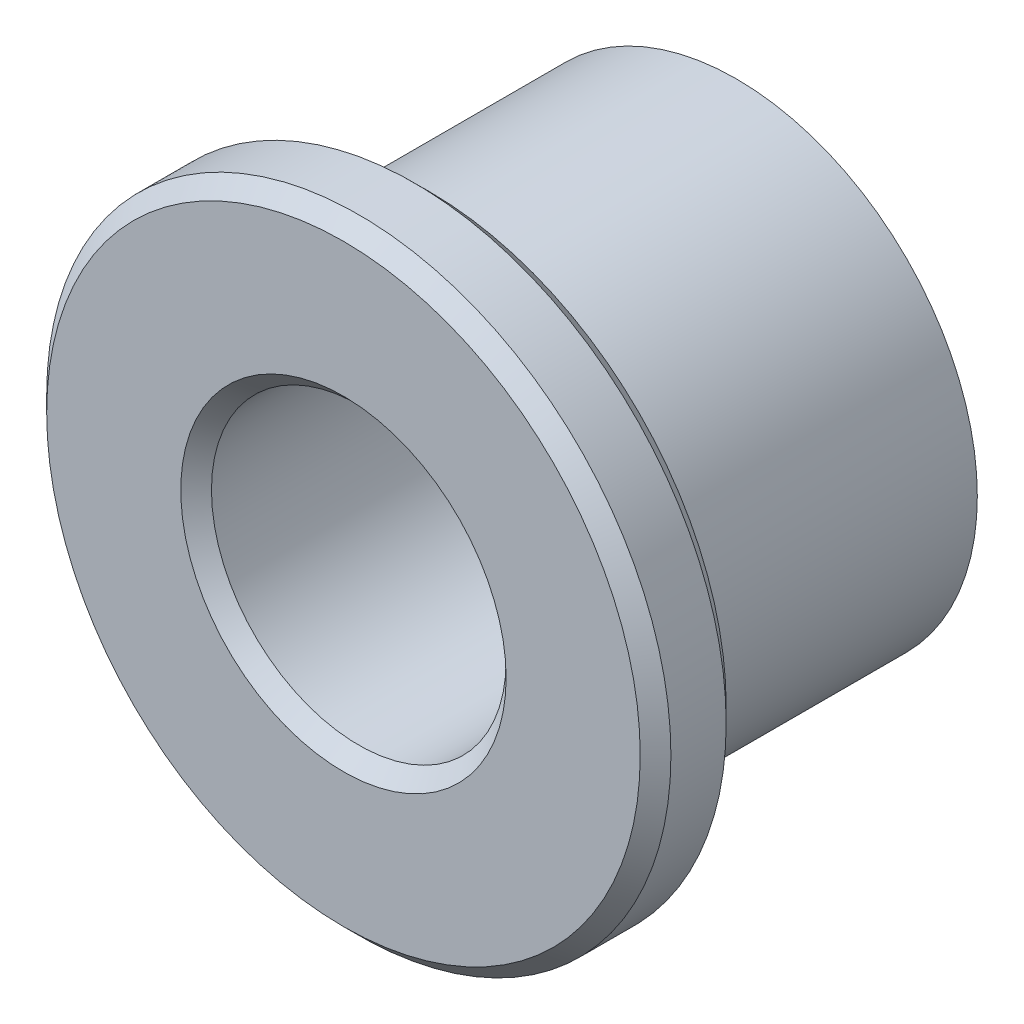
ISO-10303-21;
HEADER;
FILE_DESCRIPTION(('STEP AP214'),'2;1');
FILE_NAME('part.step','',(''),(''),'','','');
FILE_SCHEMA(('AUTOMOTIVE_DESIGN { 1 0 10303 214 1 1 1 1 }'));
ENDSEC;
DATA;
#1=APPLICATION_CONTEXT('core data for automotive mechanical design processes');
#2=APPLICATION_PROTOCOL_DEFINITION('international standard','automotive_design',2000,#1);
#3=PRODUCT_CONTEXT('',#1,'mechanical');
#4=PRODUCT('Part','Part','',(#3));
#5=PRODUCT_RELATED_PRODUCT_CATEGORY('part','',(#4));
#6=PRODUCT_DEFINITION_FORMATION('','',#4);
#7=PRODUCT_DEFINITION_CONTEXT('part definition',#1,'design');
#8=PRODUCT_DEFINITION('design','',#6,#7);
#9=PRODUCT_DEFINITION_SHAPE('','',#8);
#10=(LENGTH_UNIT() NAMED_UNIT(*) SI_UNIT(.MILLI.,.METRE.));
#11=(NAMED_UNIT(*) PLANE_ANGLE_UNIT() SI_UNIT($,.RADIAN.));
#12=(NAMED_UNIT(*) SI_UNIT($,.STERADIAN.) SOLID_ANGLE_UNIT());
#13=UNCERTAINTY_MEASURE_WITH_UNIT(LENGTH_MEASURE(1.E-05),#10,'distance_accuracy_value','');
#14=(GEOMETRIC_REPRESENTATION_CONTEXT(3) GLOBAL_UNCERTAINTY_ASSIGNED_CONTEXT((#13)) GLOBAL_UNIT_ASSIGNED_CONTEXT((#10,
#11,#12)) REPRESENTATION_CONTEXT('',''));
#15=CARTESIAN_POINT('',(0.,0.,0.));
#16=DIRECTION('',(0.,0.,1.));
#17=DIRECTION('',(1.,0.,0.));
#18=AXIS2_PLACEMENT_3D('',#15,#16,#17);
#19=CARTESIAN_POINT('',(0.,0.,-11.));
#20=DIRECTION('',(0.,0.,1.));
#21=DIRECTION('',(1.,0.,0.));
#22=AXIS2_PLACEMENT_3D('',#19,#20,#21);
#23=CYLINDRICAL_SURFACE('',#22,3.925);
#24=CARTESIAN_POINT('',(0.,0.,0.));
#25=DIRECTION('',(0.,0.,1.));
#26=DIRECTION('',(1.,0.,0.));
#27=AXIS2_PLACEMENT_3D('',#24,#25,#26);
#28=CIRCLE('',#27,3.925);
#29=CARTESIAN_POINT('',(3.925,0.,0.));
#30=VERTEX_POINT('',#29);
#31=EDGE_CURVE('E57',#30,#30,#28,.T.);
#32=ORIENTED_EDGE('',*,*,#31,.F.);
#33=EDGE_LOOP('',(#32));
#34=FACE_BOUND('',#33,.T.);
#35=CARTESIAN_POINT('',(0.,0.,-5.));
#36=DIRECTION('',(0.,0.,-1.));
#37=DIRECTION('',(-1.,0.,0.));
#38=AXIS2_PLACEMENT_3D('',#35,#36,#37);
#39=CIRCLE('',#38,3.925);
#40=CARTESIAN_POINT('',(-3.925,0.,-5.));
#41=VERTEX_POINT('',#40);
#42=EDGE_CURVE('E60',#41,#41,#39,.F.);
#43=ORIENTED_EDGE('',*,*,#42,.T.);
#44=EDGE_LOOP('',(#43));
#45=FACE_BOUND('',#44,.T.);
#46=ADVANCED_FACE('F31',(#34,#45),#23,.T.);
#47=CARTESIAN_POINT('',(0.,0.,-11.));
#48=DIRECTION('',(0.,0.,1.));
#49=DIRECTION('',(1.,0.,0.));
#50=AXIS2_PLACEMENT_3D('',#47,#48,#49);
#51=CYLINDRICAL_SURFACE('',#50,2.4);
#52=CARTESIAN_POINT('',(0.,0.,1.14999999999999));
#53=DIRECTION('',(0.,0.,1.));
#54=DIRECTION('',(1.,0.,0.));
#55=AXIS2_PLACEMENT_3D('',#52,#53,#54);
#56=CIRCLE('',#55,2.4);
#57=CARTESIAN_POINT('',(2.4,0.,1.14999999999999));
#58=VERTEX_POINT('',#57);
#59=EDGE_CURVE('E10',#58,#58,#56,.T.);
#60=CARTESIAN_POINT('',(0.,0.,-5.));
#61=DIRECTION('',(0.,0.,-1.));
#62=DIRECTION('',(-1.,0.,0.));
#63=AXIS2_PLACEMENT_3D('',#60,#61,#62);
#64=CIRCLE('',#63,2.4);
#65=CARTESIAN_POINT('',(2.4,0.,-5.));
#66=VERTEX_POINT('',#65);
#67=EDGE_CURVE('E35',#66,#66,#64,.F.);
#68=CARTESIAN_POINT('',(2.4,0.,1.14999999999999));
#69=CARTESIAN_POINT('',(2.4,0.,1.08593749999999));
#70=CARTESIAN_POINT('',(2.4,0.,1.02187499999999));
#71=CARTESIAN_POINT('',(2.4,0.,0.893749999999987));
#72=CARTESIAN_POINT('',(2.4,0.,0.829687499999987));
#73=CARTESIAN_POINT('',(2.4,0.,0.701562499999987));
#74=CARTESIAN_POINT('',(2.4,0.,0.637499999999987));
#75=CARTESIAN_POINT('',(2.4,0.,0.509374999999987));
#76=CARTESIAN_POINT('',(2.4,0.,0.445312499999987));
#77=CARTESIAN_POINT('',(2.4,0.,0.317187499999988));
#78=CARTESIAN_POINT('',(2.4,0.,0.253124999999988));
#79=CARTESIAN_POINT('',(2.4,0.,0.124999999999988));
#80=CARTESIAN_POINT('',(2.4,0.,0.0609374999999881));
#81=CARTESIAN_POINT('',(2.4,0.,-0.0671875000000117));
#82=CARTESIAN_POINT('',(2.4,0.,-0.131250000000012));
#83=CARTESIAN_POINT('',(2.4,0.,-0.259375000000011));
#84=CARTESIAN_POINT('',(2.4,0.,-0.323437500000011));
#85=CARTESIAN_POINT('',(2.4,0.,-0.451562500000011));
#86=CARTESIAN_POINT('',(2.4,0.,-0.515625000000011));
#87=CARTESIAN_POINT('',(2.4,0.,-0.643750000000011));
#88=CARTESIAN_POINT('',(2.4,0.,-0.707812500000011));
#89=CARTESIAN_POINT('',(2.4,0.,-0.83593750000001));
#90=CARTESIAN_POINT('',(2.4,0.,-0.90000000000001));
#91=CARTESIAN_POINT('',(2.4,0.,-1.02812500000001));
#92=CARTESIAN_POINT('',(2.4,0.,-1.09218750000001));
#93=CARTESIAN_POINT('',(2.4,0.,-1.22031250000001));
#94=CARTESIAN_POINT('',(2.4,0.,-1.28437500000001));
#95=CARTESIAN_POINT('',(2.4,0.,-1.41250000000001));
#96=CARTESIAN_POINT('',(2.4,0.,-1.47656250000001));
#97=CARTESIAN_POINT('',(2.4,0.,-1.60468750000001));
#98=CARTESIAN_POINT('',(2.4,0.,-1.66875000000001));
#99=CARTESIAN_POINT('',(2.4,0.,-1.79687500000001));
#100=CARTESIAN_POINT('',(2.4,0.,-1.86093750000001));
#101=CARTESIAN_POINT('',(2.4,0.,-1.98906250000001));
#102=CARTESIAN_POINT('',(2.4,0.,-2.05312500000001));
#103=CARTESIAN_POINT('',(2.4,0.,-2.18125000000001));
#104=CARTESIAN_POINT('',(2.4,0.,-2.24531250000001));
#105=CARTESIAN_POINT('',(2.4,0.,-2.37343750000001));
#106=CARTESIAN_POINT('',(2.4,0.,-2.43750000000001));
#107=CARTESIAN_POINT('',(2.4,0.,-2.56562500000001));
#108=CARTESIAN_POINT('',(2.4,0.,-2.62968750000001));
#109=CARTESIAN_POINT('',(2.4,0.,-2.75781250000001));
#110=CARTESIAN_POINT('',(2.4,0.,-2.82187500000001));
#111=CARTESIAN_POINT('',(2.4,0.,-2.95000000000001));
#112=CARTESIAN_POINT('',(2.4,0.,-3.01406250000001));
#113=CARTESIAN_POINT('',(2.4,0.,-3.14218750000001));
#114=CARTESIAN_POINT('',(2.4,0.,-3.20625000000001));
#115=CARTESIAN_POINT('',(2.4,0.,-3.334375));
#116=CARTESIAN_POINT('',(2.4,0.,-3.3984375));
#117=CARTESIAN_POINT('',(2.4,0.,-3.5265625));
#118=CARTESIAN_POINT('',(2.4,0.,-3.590625));
#119=CARTESIAN_POINT('',(2.4,0.,-3.71875));
#120=CARTESIAN_POINT('',(2.4,0.,-3.7828125));
#121=CARTESIAN_POINT('',(2.4,0.,-3.9109375));
#122=CARTESIAN_POINT('',(2.4,0.,-3.975));
#123=CARTESIAN_POINT('',(2.4,0.,-4.103125));
#124=CARTESIAN_POINT('',(2.4,0.,-4.1671875));
#125=CARTESIAN_POINT('',(2.4,0.,-4.2953125));
#126=CARTESIAN_POINT('',(2.4,0.,-4.359375));
#127=CARTESIAN_POINT('',(2.4,0.,-4.4875));
#128=CARTESIAN_POINT('',(2.4,0.,-4.5515625));
#129=CARTESIAN_POINT('',(2.4,0.,-4.6796875));
#130=CARTESIAN_POINT('',(2.4,0.,-4.74375));
#131=CARTESIAN_POINT('',(2.4,0.,-4.871875));
#132=CARTESIAN_POINT('',(2.4,0.,-4.9359375));
#133=CARTESIAN_POINT('',(2.4,0.,-5.));
#134=B_SPLINE_CURVE_WITH_KNOTS('',3,(#68,#69,#70,#71,#72,#73,#74,#75,#76,#77,#78,#79,#80,#81,
#82,#83,#84,#85,#86,#87,#88,#89,#90,#91,#92,#93,#94,#95,#96,#97,#98,#99,#100,#101,#102,#103,
#104,#105,#106,#107,#108,#109,#110,#111,#112,#113,#114,#115,#116,#117,#118,#119,#120,#121,#122,
#123,#124,#125,#126,#127,#128,#129,#130,#131,#132,#133),.UNSPECIFIED.,.F.,.F.,(4,2,2,2,2,2,2,2,
2,2,2,2,2,2,2,2,2,2,2,2,2,2,2,2,2,2,2,2,2,2,2,2,4),(0.,0.1921875,0.384374999999999,
0.576562499999999,0.768749999999999,0.960937499999998,1.153125,1.3453125,1.5375,1.7296875,
1.921875,2.1140625,2.30625,2.4984375,2.69062499999999,2.88281249999999,3.07499999999999,
3.26718749999999,3.45937499999999,3.65156249999999,3.84374999999999,4.03593749999999,
4.22812499999999,4.42031249999999,4.61249999999999,4.80468749999999,4.99687499999999,
5.18906249999999,5.38124999999999,5.57343749999999,5.76562499999999,5.95781249999999,
6.14999999999999),.UNSPECIFIED.);
#135=EDGE_CURVE('BSEAM69',#58,#66,#134,.T.);
#136=ORIENTED_EDGE('',*,*,#59,.T.);
#137=ORIENTED_EDGE('',*,*,#67,.F.);
#138=ORIENTED_EDGE('',*,*,#135,.T.);
#139=ORIENTED_EDGE('',*,*,#135,.F.);
#140=EDGE_LOOP('',(#136,#138,#137,#139));
#141=FACE_BOUND('',#140,.T.);
#142=ADVANCED_FACE('F69',(#141),#51,.F.);
#143=CARTESIAN_POINT('',(0.,0.,1.4));
#144=DIRECTION('',(0.,0.,-1.));
#145=DIRECTION('',(-1.,0.,0.));
#146=AXIS2_PLACEMENT_3D('',#143,#144,#145);
#147=CYLINDRICAL_SURFACE('',#146,5.08414963527469);
#148=CARTESIAN_POINT('',(0.,0.,0.250000000000003));
#149=DIRECTION('',(0.,0.,1.));
#150=DIRECTION('',(1.,0.,0.));
#151=AXIS2_PLACEMENT_3D('',#148,#149,#150);
#152=CIRCLE('',#151,5.08414963527469);
#153=CARTESIAN_POINT('',(5.08414963527469,0.,0.250000000000003));
#154=VERTEX_POINT('',#153);
#155=EDGE_CURVE('E51',#154,#154,#152,.T.);
#156=ORIENTED_EDGE('',*,*,#155,.T.);
#157=EDGE_LOOP('',(#156));
#158=FACE_BOUND('',#157,.T.);
#159=CARTESIAN_POINT('',(0.,0.,1.15));
#160=DIRECTION('',(0.,0.,1.));
#161=DIRECTION('',(1.,0.,0.));
#162=AXIS2_PLACEMENT_3D('',#159,#160,#161);
#163=CIRCLE('',#162,5.08414963527469);
#164=CARTESIAN_POINT('',(5.08414963527469,0.,1.15));
#165=VERTEX_POINT('',#164);
#166=EDGE_CURVE('E54',#165,#165,#163,.F.);
#167=ORIENTED_EDGE('',*,*,#166,.T.);
#168=EDGE_LOOP('',(#167));
#169=FACE_BOUND('',#168,.T.);
#170=ADVANCED_FACE('F71',(#158,#169),#147,.T.);
#171=CARTESIAN_POINT('',(0.,0.,1.4));
#172=DIRECTION('',(0.,0.,1.));
#173=DIRECTION('',(1.,0.,0.));
#174=AXIS2_PLACEMENT_3D('',#171,#172,#173);
#175=PLANE('',#174);
#176=CARTESIAN_POINT('',(0.,0.,1.4));
#177=DIRECTION('',(0.,0.,1.));
#178=DIRECTION('',(1.,0.,0.));
#179=AXIS2_PLACEMENT_3D('',#176,#177,#178);
#180=CIRCLE('',#179,4.83414963527468);
#181=CARTESIAN_POINT('',(4.83414963527468,0.,1.4));
#182=VERTEX_POINT('',#181);
#183=EDGE_CURVE('E39',#182,#182,#180,.T.);
#184=ORIENTED_EDGE('',*,*,#183,.T.);
#185=EDGE_LOOP('',(#184));
#186=FACE_BOUND('',#185,.T.);
#187=CARTESIAN_POINT('',(0.,0.,1.4));
#188=DIRECTION('',(0.,0.,1.));
#189=DIRECTION('',(1.,0.,0.));
#190=AXIS2_PLACEMENT_3D('',#187,#188,#189);
#191=CIRCLE('',#190,2.65000000000001);
#192=CARTESIAN_POINT('',(2.65000000000001,0.,1.4));
#193=VERTEX_POINT('',#192);
#194=EDGE_CURVE('E43',#193,#193,#191,.F.);
#195=ORIENTED_EDGE('',*,*,#194,.T.);
#196=EDGE_LOOP('',(#195));
#197=FACE_BOUND('',#196,.T.);
#198=ADVANCED_FACE('F78',(#186,#197),#175,.T.);
#199=CARTESIAN_POINT('',(0.,0.,0.));
#200=DIRECTION('',(0.,0.,1.));
#201=DIRECTION('',(1.,0.,0.));
#202=AXIS2_PLACEMENT_3D('',#199,#200,#201);
#203=PLANE('',#202);
#204=CARTESIAN_POINT('',(0.,0.,0.));
#205=DIRECTION('',(0.,0.,1.));
#206=DIRECTION('',(1.,0.,0.));
#207=AXIS2_PLACEMENT_3D('',#204,#205,#206);
#208=CIRCLE('',#207,4.83414963527468);
#209=CARTESIAN_POINT('',(4.83414963527468,0.,0.));
#210=VERTEX_POINT('',#209);
#211=EDGE_CURVE('E48',#210,#210,#208,.F.);
#212=ORIENTED_EDGE('',*,*,#211,.T.);
#213=EDGE_LOOP('',(#212));
#214=FACE_BOUND('',#213,.T.);
#215=ORIENTED_EDGE('',*,*,#31,.T.);
#216=EDGE_LOOP('',(#215));
#217=FACE_BOUND('',#216,.T.);
#218=ADVANCED_FACE('F87',(#214,#217),#203,.F.);
#219=CARTESIAN_POINT('',(0.,0.,0.250000000000003));
#220=DIRECTION('',(0.,0.,1.));
#221=DIRECTION('',(1.,0.,0.));
#222=AXIS2_PLACEMENT_3D('',#219,#220,#221);
#223=CONICAL_SURFACE('',#222,5.08414963527469,0.785398163397452);
#224=ORIENTED_EDGE('',*,*,#211,.F.);
#225=EDGE_LOOP('',(#224));
#226=FACE_BOUND('',#225,.T.);
#227=ORIENTED_EDGE('',*,*,#155,.F.);
#228=EDGE_LOOP('',(#227));
#229=FACE_BOUND('',#228,.T.);
#230=ADVANCED_FACE('F90',(#226,#229),#223,.T.);
#231=CARTESIAN_POINT('',(0.,0.,1.4));
#232=DIRECTION('',(0.,0.,-1.));
#233=DIRECTION('',(-1.,0.,0.));
#234=AXIS2_PLACEMENT_3D('',#231,#232,#233);
#235=CONICAL_SURFACE('',#234,4.83414963527468,0.785398163397452);
#236=ORIENTED_EDGE('',*,*,#166,.F.);
#237=EDGE_LOOP('',(#236));
#238=FACE_BOUND('',#237,.T.);
#239=ORIENTED_EDGE('',*,*,#183,.F.);
#240=EDGE_LOOP('',(#239));
#241=FACE_BOUND('',#240,.T.);
#242=ADVANCED_FACE('F94',(#238,#241),#235,.T.);
#243=CARTESIAN_POINT('',(0.,0.,1.14999999999999));
#244=DIRECTION('',(0.,0.,1.));
#245=DIRECTION('',(1.,0.,0.));
#246=AXIS2_PLACEMENT_3D('',#243,#244,#245);
#247=CONICAL_SURFACE('',#246,2.4,0.785398163397453);
#248=ORIENTED_EDGE('',*,*,#194,.F.);
#249=EDGE_LOOP('',(#248));
#250=FACE_BOUND('',#249,.T.);
#251=ORIENTED_EDGE('',*,*,#59,.F.);
#252=EDGE_LOOP('',(#251));
#253=FACE_BOUND('',#252,.T.);
#254=ADVANCED_FACE('F33',(#250,#253),#247,.F.);
#255=CARTESIAN_POINT('',(0.,0.,-5.));
#256=DIRECTION('',(0.,0.,-1.));
#257=DIRECTION('',(0.705585745819289,-0.708624551717366,0.));
#258=AXIS2_PLACEMENT_3D('',#255,#256,#257);
#259=PLANE('',#258);
#260=ORIENTED_EDGE('',*,*,#42,.F.);
#261=EDGE_LOOP('',(#260));
#262=FACE_BOUND('',#261,.T.);
#263=ORIENTED_EDGE('',*,*,#67,.T.);
#264=EDGE_LOOP('',(#263));
#265=FACE_BOUND('',#264,.T.);
#266=ADVANCED_FACE('F67',(#262,#265),#259,.T.);
#267=CLOSED_SHELL('',(#46,#142,#170,#198,#218,#230,#242,#254,#266));
#268=MANIFOLD_SOLID_BREP('B2',#267);
#269=ADVANCED_BREP_SHAPE_REPRESENTATION('',(#18,#268),#14);
#270=SHAPE_DEFINITION_REPRESENTATION(#9,#269);
ENDSEC;
END-ISO-10303-21;
